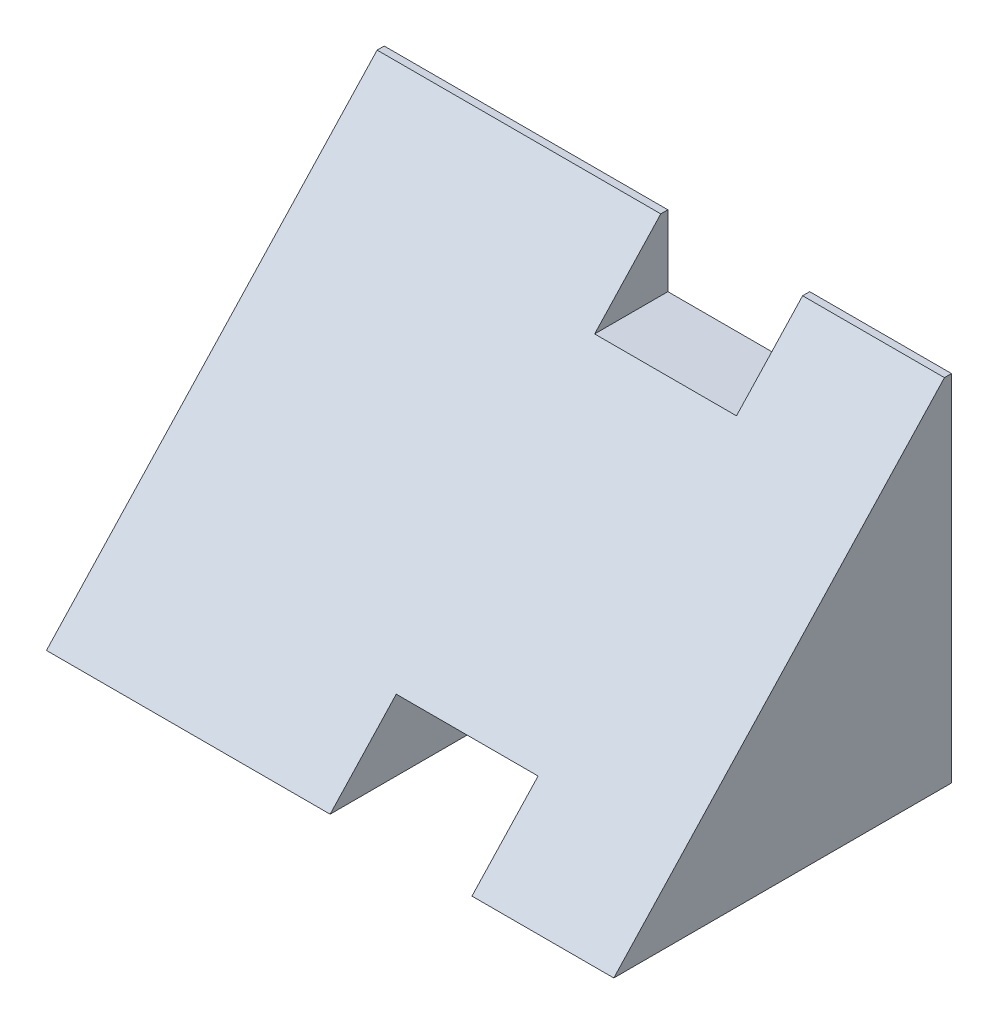
ISO-10303-21;
HEADER;
FILE_DESCRIPTION(('STEP AP214'),'2;1');
FILE_NAME('part.step','',(''),(''),'','','');
FILE_SCHEMA(('AUTOMOTIVE_DESIGN { 1 0 10303 214 1 1 1 1 }'));
ENDSEC;
DATA;
#1=APPLICATION_CONTEXT('core data for automotive mechanical design processes');
#2=APPLICATION_PROTOCOL_DEFINITION('international standard','automotive_design',2000,#1);
#3=PRODUCT_CONTEXT('',#1,'mechanical');
#4=PRODUCT('Part','Part','',(#3));
#5=PRODUCT_RELATED_PRODUCT_CATEGORY('part','',(#4));
#6=PRODUCT_DEFINITION_FORMATION('','',#4);
#7=PRODUCT_DEFINITION_CONTEXT('part definition',#1,'design');
#8=PRODUCT_DEFINITION('design','',#6,#7);
#9=PRODUCT_DEFINITION_SHAPE('','',#8);
#10=(LENGTH_UNIT() NAMED_UNIT(*) SI_UNIT(.MILLI.,.METRE.));
#11=(NAMED_UNIT(*) PLANE_ANGLE_UNIT() SI_UNIT($,.RADIAN.));
#12=(NAMED_UNIT(*) SI_UNIT($,.STERADIAN.) SOLID_ANGLE_UNIT());
#13=UNCERTAINTY_MEASURE_WITH_UNIT(LENGTH_MEASURE(1.E-05),#10,'distance_accuracy_value','');
#14=(GEOMETRIC_REPRESENTATION_CONTEXT(3) GLOBAL_UNCERTAINTY_ASSIGNED_CONTEXT((#13)) GLOBAL_UNIT_ASSIGNED_CONTEXT((#10,
#11,#12)) REPRESENTATION_CONTEXT('',''));
#15=CARTESIAN_POINT('',(0.,0.,0.));
#16=DIRECTION('',(0.,0.,1.));
#17=DIRECTION('',(1.,0.,0.));
#18=AXIS2_PLACEMENT_3D('',#15,#16,#17);
#19=CARTESIAN_POINT('',(-9.64428124369068,-50.,0.999999999999997));
#20=DIRECTION('',(1.,0.,0.));
#21=DIRECTION('',(0.,0.,-1.));
#22=AXIS2_PLACEMENT_3D('',#19,#20,#21);
#23=PLANE('',#22);
#24=DIRECTION('',(0.,-1.,0.));
#25=VECTOR('',#24,1.);
#26=CARTESIAN_POINT('',(-9.64428124369068,-50.,0.));
#27=LINE('',#26,#25);
#28=CARTESIAN_POINT('',(-9.64428124369068,0.,0.));
#29=VERTEX_POINT('',#28);
#30=CARTESIAN_POINT('',(-9.64428124369068,-50.,0.));
#31=VERTEX_POINT('',#30);
#32=EDGE_CURVE('E133',#29,#31,#27,.T.);
#33=ORIENTED_EDGE('',*,*,#32,.T.);
#34=DIRECTION('',(0.,0.,-1.));
#35=VECTOR('',#34,1.);
#36=CARTESIAN_POINT('',(-9.64428124369068,-50.,0.999999999999997));
#37=LINE('',#36,#35);
#38=CARTESIAN_POINT('',(-9.64428124369068,-50.,47.6257543068832));
#39=VERTEX_POINT('',#38);
#40=EDGE_CURVE('E11',#39,#31,#37,.T.);
#41=ORIENTED_EDGE('',*,*,#40,.F.);
#42=DIRECTION('',(0.,0.731353701619169,-0.6819983600625));
#43=VECTOR('',#42,1.);
#44=CARTESIAN_POINT('',(-9.64428124369068,0.,0.999999999999997));
#45=LINE('',#44,#43);
#46=CARTESIAN_POINT('',(-9.64428124369068,0.,0.999999999999997));
#47=VERTEX_POINT('',#46);
#48=EDGE_CURVE('E126',#47,#39,#45,.F.);
#49=ORIENTED_EDGE('',*,*,#48,.F.);
#50=DIRECTION('',(0.,0.,-1.));
#51=VECTOR('',#50,1.);
#52=CARTESIAN_POINT('',(-9.64428124369068,0.,0.999999999999997));
#53=LINE('',#52,#51);
#54=EDGE_CURVE('E134',#47,#29,#53,.T.);
#55=ORIENTED_EDGE('',*,*,#54,.T.);
#56=EDGE_LOOP('',(#33,#41,#49,#55));
#57=FACE_BOUND('',#56,.T.);
#58=ADVANCED_FACE('F33',(#57),#23,.F.);
#59=CARTESIAN_POINT('',(30.3557187563093,-50.,0.999999999999997));
#60=DIRECTION('',(0.,1.,0.));
#61=DIRECTION('',(-1.,0.,0.));
#62=AXIS2_PLACEMENT_3D('',#59,#60,#61);
#63=PLANE('',#62);
#64=DIRECTION('',(1.,0.,0.));
#65=VECTOR('',#64,1.);
#66=CARTESIAN_POINT('',(30.3557187563093,-50.,0.));
#67=LINE('',#66,#65);
#68=CARTESIAN_POINT('',(30.3557187563093,-50.,0.));
#69=VERTEX_POINT('',#68);
#70=EDGE_CURVE('E137',#31,#69,#67,.T.);
#71=ORIENTED_EDGE('',*,*,#70,.T.);
#72=DIRECTION('',(0.,0.,-1.));
#73=VECTOR('',#72,1.);
#74=CARTESIAN_POINT('',(30.3557187563093,-50.,0.999999999999997));
#75=LINE('',#74,#73);
#76=CARTESIAN_POINT('',(30.3557187563093,-50.,47.6257543068832));
#77=VERTEX_POINT('',#76);
#78=EDGE_CURVE('E43',#77,#69,#75,.T.);
#79=ORIENTED_EDGE('',*,*,#78,.F.);
#80=DIRECTION('',(-1.,0.,0.));
#81=VECTOR('',#80,1.);
#82=CARTESIAN_POINT('',(-9.64428124369067,-50.,47.6257543068832));
#83=LINE('',#82,#81);
#84=EDGE_CURVE('E37',#39,#77,#83,.F.);
#85=ORIENTED_EDGE('',*,*,#84,.F.);
#86=ORIENTED_EDGE('',*,*,#40,.T.);
#87=EDGE_LOOP('',(#71,#79,#85,#86));
#88=FACE_BOUND('',#87,.T.);
#89=ADVANCED_FACE('F120',(#88),#63,.F.);
#90=CARTESIAN_POINT('',(30.3557187563093,-40.,0.999999999999997));
#91=DIRECTION('',(-1.,0.,0.));
#92=DIRECTION('',(0.,0.,1.));
#93=AXIS2_PLACEMENT_3D('',#90,#91,#92);
#94=PLANE('',#93);
#95=DIRECTION('',(0.,1.,0.));
#96=VECTOR('',#95,1.);
#97=CARTESIAN_POINT('',(30.3557187563093,-40.,0.));
#98=LINE('',#97,#96);
#99=CARTESIAN_POINT('',(30.3557187563093,-40.,0.));
#100=VERTEX_POINT('',#99);
#101=EDGE_CURVE('E139',#69,#100,#98,.T.);
#102=ORIENTED_EDGE('',*,*,#101,.T.);
#103=DIRECTION('',(0.,0.,-1.));
#104=VECTOR('',#103,1.);
#105=CARTESIAN_POINT('',(30.3557187563093,-40.,0.999999999999997));
#106=LINE('',#105,#104);
#107=CARTESIAN_POINT('',(30.3557187563093,-40.,38.3006034455066));
#108=VERTEX_POINT('',#107);
#109=EDGE_CURVE('E186',#108,#100,#106,.T.);
#110=ORIENTED_EDGE('',*,*,#109,.F.);
#111=DIRECTION('',(0.,-0.731353701619169,0.6819983600625));
#112=VECTOR('',#111,1.);
#113=CARTESIAN_POINT('',(30.3557187563093,0.,0.999999999999997));
#114=LINE('',#113,#112);
#115=EDGE_CURVE('E125',#77,#108,#114,.F.);
#116=ORIENTED_EDGE('',*,*,#115,.F.);
#117=ORIENTED_EDGE('',*,*,#78,.T.);
#118=EDGE_LOOP('',(#102,#110,#116,#117));
#119=FACE_BOUND('',#118,.T.);
#120=ADVANCED_FACE('F209',(#119),#94,.F.);
#121=CARTESIAN_POINT('',(50.3557187563093,-40.,0.999999999999997));
#122=DIRECTION('',(0.,1.,0.));
#123=DIRECTION('',(-1.,0.,0.));
#124=AXIS2_PLACEMENT_3D('',#121,#122,#123);
#125=PLANE('',#124);
#126=DIRECTION('',(1.,0.,0.));
#127=VECTOR('',#126,1.);
#128=CARTESIAN_POINT('',(50.3557187563093,-40.,0.));
#129=LINE('',#128,#127);
#130=CARTESIAN_POINT('',(50.3557187563093,-40.,0.));
#131=VERTEX_POINT('',#130);
#132=EDGE_CURVE('E144',#100,#131,#129,.T.);
#133=ORIENTED_EDGE('',*,*,#132,.T.);
#134=DIRECTION('',(0.,0.,-1.));
#135=VECTOR('',#134,1.);
#136=CARTESIAN_POINT('',(50.3557187563093,-40.,0.999999999999997));
#137=LINE('',#136,#135);
#138=CARTESIAN_POINT('',(50.3557187563093,-40.,38.3006034455066));
#139=VERTEX_POINT('',#138);
#140=EDGE_CURVE('E183',#139,#131,#137,.T.);
#141=ORIENTED_EDGE('',*,*,#140,.F.);
#142=DIRECTION('',(-1.,0.,0.));
#143=VECTOR('',#142,1.);
#144=CARTESIAN_POINT('',(-9.64428124369066,-40.,38.3006034455066));
#145=LINE('',#144,#143);
#146=EDGE_CURVE('E204',#108,#139,#145,.F.);
#147=ORIENTED_EDGE('',*,*,#146,.F.);
#148=ORIENTED_EDGE('',*,*,#109,.T.);
#149=EDGE_LOOP('',(#133,#141,#147,#148));
#150=FACE_BOUND('',#149,.T.);
#151=ADVANCED_FACE('F213',(#150),#125,.F.);
#152=CARTESIAN_POINT('',(50.3557187563093,-50.,0.999999999999997));
#153=DIRECTION('',(1.,0.,0.));
#154=DIRECTION('',(0.,0.,-1.));
#155=AXIS2_PLACEMENT_3D('',#152,#153,#154);
#156=PLANE('',#155);
#157=DIRECTION('',(0.,-1.,0.));
#158=VECTOR('',#157,1.);
#159=CARTESIAN_POINT('',(50.3557187563093,-50.,0.));
#160=LINE('',#159,#158);
#161=CARTESIAN_POINT('',(50.3557187563093,-50.,0.));
#162=VERTEX_POINT('',#161);
#163=EDGE_CURVE('E146',#131,#162,#160,.T.);
#164=ORIENTED_EDGE('',*,*,#163,.T.);
#165=DIRECTION('',(0.,0.,-1.));
#166=VECTOR('',#165,1.);
#167=CARTESIAN_POINT('',(50.3557187563093,-50.,0.999999999999997));
#168=LINE('',#167,#166);
#169=CARTESIAN_POINT('',(50.3557187563093,-50.,47.6257543068832));
#170=VERTEX_POINT('',#169);
#171=EDGE_CURVE('E180',#170,#162,#168,.T.);
#172=ORIENTED_EDGE('',*,*,#171,.F.);
#173=DIRECTION('',(0.,0.731353701619169,-0.6819983600625));
#174=VECTOR('',#173,1.);
#175=CARTESIAN_POINT('',(50.3557187563093,0.,0.999999999999997));
#176=LINE('',#175,#174);
#177=EDGE_CURVE('E202',#139,#170,#176,.F.);
#178=ORIENTED_EDGE('',*,*,#177,.F.);
#179=ORIENTED_EDGE('',*,*,#140,.T.);
#180=EDGE_LOOP('',(#164,#172,#178,#179));
#181=FACE_BOUND('',#180,.T.);
#182=ADVANCED_FACE('F218',(#181),#156,.F.);
#183=CARTESIAN_POINT('',(70.3557187563093,-50.,0.999999999999997));
#184=DIRECTION('',(0.,1.,0.));
#185=DIRECTION('',(0.,0.,1.));
#186=AXIS2_PLACEMENT_3D('',#183,#184,#185);
#187=PLANE('',#186);
#188=DIRECTION('',(1.,0.,0.));
#189=VECTOR('',#188,1.);
#190=CARTESIAN_POINT('',(70.3557187563093,-50.,0.));
#191=LINE('',#190,#189);
#192=CARTESIAN_POINT('',(70.3557187563093,-50.,0.));
#193=VERTEX_POINT('',#192);
#194=EDGE_CURVE('E148',#162,#193,#191,.T.);
#195=ORIENTED_EDGE('',*,*,#194,.T.);
#196=DIRECTION('',(0.,0.,-1.));
#197=VECTOR('',#196,1.);
#198=CARTESIAN_POINT('',(70.3557187563093,-50.,0.999999999999997));
#199=LINE('',#198,#197);
#200=CARTESIAN_POINT('',(70.3557187563093,-50.,47.6257543068832));
#201=VERTEX_POINT('',#200);
#202=EDGE_CURVE('E177',#201,#193,#199,.T.);
#203=ORIENTED_EDGE('',*,*,#202,.F.);
#204=DIRECTION('',(-1.,0.,0.));
#205=VECTOR('',#204,1.);
#206=CARTESIAN_POINT('',(-9.64428124369068,-50.,47.6257543068832));
#207=LINE('',#206,#205);
#208=EDGE_CURVE('E200',#170,#201,#207,.F.);
#209=ORIENTED_EDGE('',*,*,#208,.F.);
#210=ORIENTED_EDGE('',*,*,#171,.T.);
#211=EDGE_LOOP('',(#195,#203,#209,#210));
#212=FACE_BOUND('',#211,.T.);
#213=ADVANCED_FACE('F224',(#212),#187,.F.);
#214=CARTESIAN_POINT('',(70.3557187563093,0.,0.999999999999997));
#215=DIRECTION('',(-1.,0.,0.));
#216=DIRECTION('',(0.,0.,1.));
#217=AXIS2_PLACEMENT_3D('',#214,#215,#216);
#218=PLANE('',#217);
#219=DIRECTION('',(0.,1.,0.));
#220=VECTOR('',#219,1.);
#221=CARTESIAN_POINT('',(70.3557187563093,0.,0.));
#222=LINE('',#221,#220);
#223=CARTESIAN_POINT('',(70.3557187563093,0.,0.));
#224=VERTEX_POINT('',#223);
#225=EDGE_CURVE('E150',#193,#224,#222,.T.);
#226=ORIENTED_EDGE('',*,*,#225,.T.);
#227=DIRECTION('',(0.,0.,-1.));
#228=VECTOR('',#227,1.);
#229=CARTESIAN_POINT('',(70.3557187563093,0.,0.999999999999997));
#230=LINE('',#229,#228);
#231=CARTESIAN_POINT('',(70.3557187563093,0.,0.999999999999997));
#232=VERTEX_POINT('',#231);
#233=EDGE_CURVE('E174',#232,#224,#230,.T.);
#234=ORIENTED_EDGE('',*,*,#233,.F.);
#235=DIRECTION('',(0.,-0.731353701619169,0.6819983600625));
#236=VECTOR('',#235,1.);
#237=CARTESIAN_POINT('',(70.3557187563093,0.,0.999999999999997));
#238=LINE('',#237,#236);
#239=EDGE_CURVE('E198',#201,#232,#238,.F.);
#240=ORIENTED_EDGE('',*,*,#239,.F.);
#241=ORIENTED_EDGE('',*,*,#202,.T.);
#242=EDGE_LOOP('',(#226,#234,#240,#241));
#243=FACE_BOUND('',#242,.T.);
#244=ADVANCED_FACE('F228',(#243),#218,.F.);
#245=CARTESIAN_POINT('',(50.3557187563093,0.,0.999999999999997));
#246=DIRECTION('',(0.,-1.,0.));
#247=DIRECTION('',(0.,0.,-1.));
#248=AXIS2_PLACEMENT_3D('',#245,#246,#247);
#249=PLANE('',#248);
#250=DIRECTION('',(-1.,0.,0.));
#251=VECTOR('',#250,1.);
#252=CARTESIAN_POINT('',(50.3557187563093,0.,0.));
#253=LINE('',#252,#251);
#254=CARTESIAN_POINT('',(50.3557187563093,0.,0.));
#255=VERTEX_POINT('',#254);
#256=EDGE_CURVE('E152',#224,#255,#253,.T.);
#257=ORIENTED_EDGE('',*,*,#256,.T.);
#258=DIRECTION('',(0.,0.,-1.));
#259=VECTOR('',#258,1.);
#260=CARTESIAN_POINT('',(50.3557187563093,0.,0.999999999999997));
#261=LINE('',#260,#259);
#262=CARTESIAN_POINT('',(50.3557187563093,0.,0.999999999999997));
#263=VERTEX_POINT('',#262);
#264=EDGE_CURVE('E171',#263,#255,#261,.T.);
#265=ORIENTED_EDGE('',*,*,#264,.F.);
#266=DIRECTION('',(1.,0.,0.));
#267=VECTOR('',#266,1.);
#268=CARTESIAN_POINT('',(-9.64428124369068,0.,0.999999999999997));
#269=LINE('',#268,#267);
#270=EDGE_CURVE('E196',#232,#263,#269,.F.);
#271=ORIENTED_EDGE('',*,*,#270,.F.);
#272=ORIENTED_EDGE('',*,*,#233,.T.);
#273=EDGE_LOOP('',(#257,#265,#271,#272));
#274=FACE_BOUND('',#273,.T.);
#275=ADVANCED_FACE('F233',(#274),#249,.F.);
#276=CARTESIAN_POINT('',(50.3557187563093,-10.,0.999999999999997));
#277=DIRECTION('',(1.,0.,0.));
#278=DIRECTION('',(0.,0.,-1.));
#279=AXIS2_PLACEMENT_3D('',#276,#277,#278);
#280=PLANE('',#279);
#281=DIRECTION('',(0.,-1.,0.));
#282=VECTOR('',#281,1.);
#283=CARTESIAN_POINT('',(50.3557187563093,-10.,0.));
#284=LINE('',#283,#282);
#285=CARTESIAN_POINT('',(50.3557187563093,-10.,0.));
#286=VERTEX_POINT('',#285);
#287=EDGE_CURVE('E154',#255,#286,#284,.T.);
#288=ORIENTED_EDGE('',*,*,#287,.T.);
#289=DIRECTION('',(0.,0.,-1.));
#290=VECTOR('',#289,1.);
#291=CARTESIAN_POINT('',(50.3557187563093,-10.,0.999999999999997));
#292=LINE('',#291,#290);
#293=CARTESIAN_POINT('',(50.3557187563093,-10.,10.3251508613766));
#294=VERTEX_POINT('',#293);
#295=EDGE_CURVE('E168',#294,#286,#292,.T.);
#296=ORIENTED_EDGE('',*,*,#295,.F.);
#297=DIRECTION('',(0.,0.731353701619169,-0.6819983600625));
#298=VECTOR('',#297,1.);
#299=CARTESIAN_POINT('',(50.3557187563093,0.,0.999999999999997));
#300=LINE('',#299,#298);
#301=EDGE_CURVE('E194',#263,#294,#300,.F.);
#302=ORIENTED_EDGE('',*,*,#301,.F.);
#303=ORIENTED_EDGE('',*,*,#264,.T.);
#304=EDGE_LOOP('',(#288,#296,#302,#303));
#305=FACE_BOUND('',#304,.T.);
#306=ADVANCED_FACE('F239',(#305),#280,.F.);
#307=CARTESIAN_POINT('',(30.3557187563093,-10.,0.999999999999997));
#308=DIRECTION('',(0.,-1.,0.));
#309=DIRECTION('',(0.,0.,-1.));
#310=AXIS2_PLACEMENT_3D('',#307,#308,#309);
#311=PLANE('',#310);
#312=DIRECTION('',(-1.,0.,0.));
#313=VECTOR('',#312,1.);
#314=CARTESIAN_POINT('',(30.3557187563093,-10.,0.));
#315=LINE('',#314,#313);
#316=CARTESIAN_POINT('',(30.3557187563093,-10.,0.));
#317=VERTEX_POINT('',#316);
#318=EDGE_CURVE('E156',#286,#317,#315,.T.);
#319=ORIENTED_EDGE('',*,*,#318,.T.);
#320=DIRECTION('',(0.,0.,-1.));
#321=VECTOR('',#320,1.);
#322=CARTESIAN_POINT('',(30.3557187563093,-10.,0.999999999999997));
#323=LINE('',#322,#321);
#324=CARTESIAN_POINT('',(30.3557187563093,-10.,10.3251508613766));
#325=VERTEX_POINT('',#324);
#326=EDGE_CURVE('E165',#325,#317,#323,.T.);
#327=ORIENTED_EDGE('',*,*,#326,.F.);
#328=DIRECTION('',(1.,0.,0.));
#329=VECTOR('',#328,1.);
#330=CARTESIAN_POINT('',(-9.64428124369068,-10.,10.3251508613766));
#331=LINE('',#330,#329);
#332=EDGE_CURVE('E192',#294,#325,#331,.F.);
#333=ORIENTED_EDGE('',*,*,#332,.F.);
#334=ORIENTED_EDGE('',*,*,#295,.T.);
#335=EDGE_LOOP('',(#319,#327,#333,#334));
#336=FACE_BOUND('',#335,.T.);
#337=ADVANCED_FACE('F243',(#336),#311,.F.);
#338=CARTESIAN_POINT('',(30.3557187563093,0.,0.999999999999997));
#339=DIRECTION('',(-1.,0.,0.));
#340=DIRECTION('',(0.,0.,1.));
#341=AXIS2_PLACEMENT_3D('',#338,#339,#340);
#342=PLANE('',#341);
#343=DIRECTION('',(0.,1.,0.));
#344=VECTOR('',#343,1.);
#345=CARTESIAN_POINT('',(30.3557187563093,0.,0.));
#346=LINE('',#345,#344);
#347=CARTESIAN_POINT('',(30.3557187563093,0.,0.));
#348=VERTEX_POINT('',#347);
#349=EDGE_CURVE('E158',#317,#348,#346,.T.);
#350=ORIENTED_EDGE('',*,*,#349,.T.);
#351=DIRECTION('',(0.,0.,-1.));
#352=VECTOR('',#351,1.);
#353=CARTESIAN_POINT('',(30.3557187563093,0.,0.999999999999997));
#354=LINE('',#353,#352);
#355=CARTESIAN_POINT('',(30.3557187563093,0.,0.999999999999997));
#356=VERTEX_POINT('',#355);
#357=EDGE_CURVE('E162',#356,#348,#354,.T.);
#358=ORIENTED_EDGE('',*,*,#357,.F.);
#359=DIRECTION('',(0.,-0.731353701619169,0.6819983600625));
#360=VECTOR('',#359,1.);
#361=CARTESIAN_POINT('',(30.3557187563093,0.,0.999999999999997));
#362=LINE('',#361,#360);
#363=EDGE_CURVE('E190',#325,#356,#362,.F.);
#364=ORIENTED_EDGE('',*,*,#363,.F.);
#365=ORIENTED_EDGE('',*,*,#326,.T.);
#366=EDGE_LOOP('',(#350,#358,#364,#365));
#367=FACE_BOUND('',#366,.T.);
#368=ADVANCED_FACE('F248',(#367),#342,.F.);
#369=CARTESIAN_POINT('',(-9.64428124369068,0.,0.999999999999997));
#370=DIRECTION('',(0.,-1.,0.));
#371=DIRECTION('',(1.,0.,0.));
#372=AXIS2_PLACEMENT_3D('',#369,#370,#371);
#373=PLANE('',#372);
#374=DIRECTION('',(-1.,0.,0.));
#375=VECTOR('',#374,1.);
#376=CARTESIAN_POINT('',(-9.64428124369068,0.,0.));
#377=LINE('',#376,#375);
#378=EDGE_CURVE('E130',#348,#29,#377,.T.);
#379=ORIENTED_EDGE('',*,*,#378,.T.);
#380=ORIENTED_EDGE('',*,*,#54,.F.);
#381=DIRECTION('',(-1.,0.,0.));
#382=VECTOR('',#381,1.);
#383=CARTESIAN_POINT('',(-9.64428124369068,0.,0.999999999999997));
#384=LINE('',#383,#382);
#385=EDGE_CURVE('E52',#356,#47,#384,.T.);
#386=ORIENTED_EDGE('',*,*,#385,.F.);
#387=ORIENTED_EDGE('',*,*,#357,.T.);
#388=EDGE_LOOP('',(#379,#380,#386,#387));
#389=FACE_BOUND('',#388,.T.);
#390=ADVANCED_FACE('F250',(#389),#373,.F.);
#391=CARTESIAN_POINT('',(-9.64428124369068,0.,0.999999999999997));
#392=DIRECTION('',(0.,0.6819983600625,0.731353701619169));
#393=DIRECTION('',(0.,-0.731353701619169,0.6819983600625));
#394=AXIS2_PLACEMENT_3D('',#391,#392,#393);
#395=PLANE('',#394);
#396=ORIENTED_EDGE('',*,*,#48,.T.);
#397=ORIENTED_EDGE('',*,*,#84,.T.);
#398=ORIENTED_EDGE('',*,*,#115,.T.);
#399=ORIENTED_EDGE('',*,*,#146,.T.);
#400=ORIENTED_EDGE('',*,*,#177,.T.);
#401=ORIENTED_EDGE('',*,*,#208,.T.);
#402=ORIENTED_EDGE('',*,*,#239,.T.);
#403=ORIENTED_EDGE('',*,*,#270,.T.);
#404=ORIENTED_EDGE('',*,*,#301,.T.);
#405=ORIENTED_EDGE('',*,*,#332,.T.);
#406=ORIENTED_EDGE('',*,*,#363,.T.);
#407=ORIENTED_EDGE('',*,*,#385,.T.);
#408=EDGE_LOOP('',(#396,#397,#398,#399,#400,#401,#402,#403,#404,#405,#406,#407));
#409=FACE_BOUND('',#408,.T.);
#410=ADVANCED_FACE('F35',(#409),#395,.T.);
#411=CARTESIAN_POINT('',(0.,0.,0.));
#412=DIRECTION('',(0.,0.,-1.));
#413=DIRECTION('',(-1.,0.,0.));
#414=AXIS2_PLACEMENT_3D('',#411,#412,#413);
#415=PLANE('',#414);
#416=ORIENTED_EDGE('',*,*,#32,.F.);
#417=ORIENTED_EDGE('',*,*,#378,.F.);
#418=ORIENTED_EDGE('',*,*,#349,.F.);
#419=ORIENTED_EDGE('',*,*,#318,.F.);
#420=ORIENTED_EDGE('',*,*,#287,.F.);
#421=ORIENTED_EDGE('',*,*,#256,.F.);
#422=ORIENTED_EDGE('',*,*,#225,.F.);
#423=ORIENTED_EDGE('',*,*,#194,.F.);
#424=ORIENTED_EDGE('',*,*,#163,.F.);
#425=ORIENTED_EDGE('',*,*,#132,.F.);
#426=ORIENTED_EDGE('',*,*,#101,.F.);
#427=ORIENTED_EDGE('',*,*,#70,.F.);
#428=EDGE_LOOP('',(#416,#417,#418,#419,#420,#421,#422,#423,#424,#425,#426,#427));
#429=FACE_BOUND('',#428,.T.);
#430=ADVANCED_FACE('F251',(#429),#415,.T.);
#431=CLOSED_SHELL('',(#58,#89,#120,#151,#182,#213,#244,#275,#306,#337,#368,#390,#410,#430));
#432=MANIFOLD_SOLID_BREP('B2',#431);
#433=ADVANCED_BREP_SHAPE_REPRESENTATION('',(#18,#432),#14);
#434=SHAPE_DEFINITION_REPRESENTATION(#9,#433);
ENDSEC;
END-ISO-10303-21;
